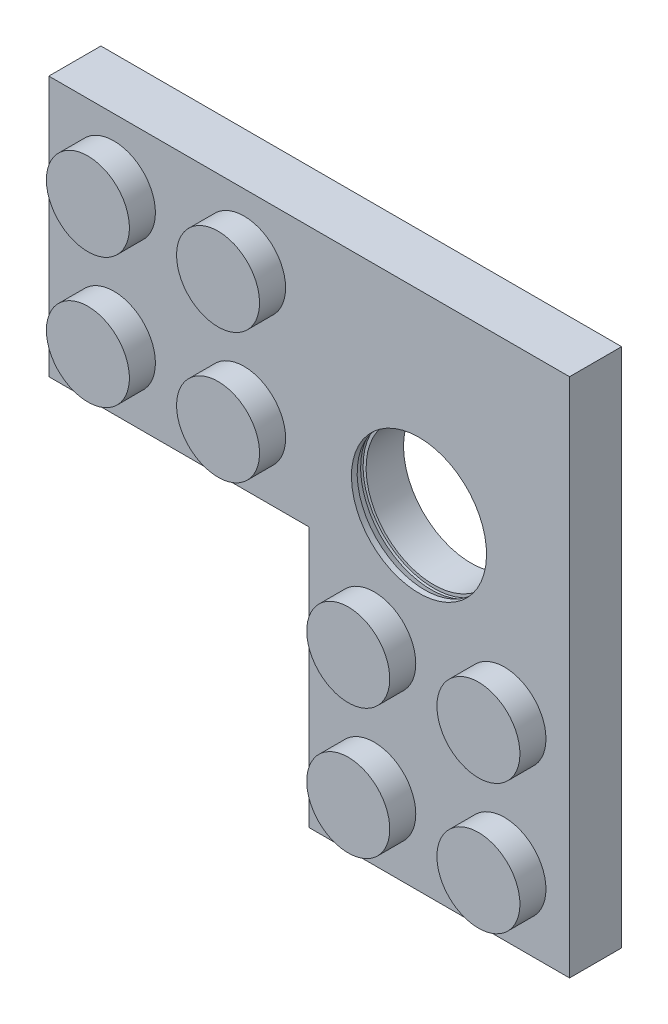
ISO-10303-21;
HEADER;
FILE_DESCRIPTION(('STEP AP214'),'2;1');
FILE_NAME('part.step','',(''),(''),'','','');
FILE_SCHEMA(('AUTOMOTIVE_DESIGN { 1 0 10303 214 1 1 1 1 }'));
ENDSEC;
DATA;
#1=APPLICATION_CONTEXT('core data for automotive mechanical design processes');
#2=APPLICATION_PROTOCOL_DEFINITION('international standard','automotive_design',2000,#1);
#3=PRODUCT_CONTEXT('',#1,'mechanical');
#4=PRODUCT('Part','Part','',(#3));
#5=PRODUCT_RELATED_PRODUCT_CATEGORY('part','',(#4));
#6=PRODUCT_DEFINITION_FORMATION('','',#4);
#7=PRODUCT_DEFINITION_CONTEXT('part definition',#1,'design');
#8=PRODUCT_DEFINITION('design','',#6,#7);
#9=PRODUCT_DEFINITION_SHAPE('','',#8);
#10=(LENGTH_UNIT() NAMED_UNIT(*) SI_UNIT(.MILLI.,.METRE.));
#11=(NAMED_UNIT(*) PLANE_ANGLE_UNIT() SI_UNIT($,.RADIAN.));
#12=(NAMED_UNIT(*) SI_UNIT($,.STERADIAN.) SOLID_ANGLE_UNIT());
#13=UNCERTAINTY_MEASURE_WITH_UNIT(LENGTH_MEASURE(1.E-05),#10,'distance_accuracy_value','');
#14=(GEOMETRIC_REPRESENTATION_CONTEXT(3) GLOBAL_UNCERTAINTY_ASSIGNED_CONTEXT((#13)) GLOBAL_UNIT_ASSIGNED_CONTEXT((#10,
#11,#12)) REPRESENTATION_CONTEXT('',''));
#15=CARTESIAN_POINT('',(0.,0.,0.));
#16=DIRECTION('',(0.,0.,1.));
#17=DIRECTION('',(1.,0.,0.));
#18=AXIS2_PLACEMENT_3D('',#15,#16,#17);
#19=CARTESIAN_POINT('',(4.24621662060961,-52.5000000000012,-20.6000041160965));
#20=DIRECTION('',(0.,0.,1.));
#21=DIRECTION('',(0.,-1.,0.));
#22=AXIS2_PLACEMENT_3D('',#19,#20,#21);
#23=CYLINDRICAL_SURFACE('',#22,4.15);
#24=CARTESIAN_POINT('',(4.24621662060961,-52.5000000000012,-18.3000041160965));
#25=DIRECTION('',(0.,0.,-1.));
#26=DIRECTION('',(0.,1.,0.));
#27=AXIS2_PLACEMENT_3D('',#24,#25,#26);
#28=CIRCLE('',#27,4.15);
#29=CARTESIAN_POINT('',(4.24621662060961,-48.3500000000012,-18.3000041160965));
#30=VERTEX_POINT('',#29);
#31=EDGE_CURVE('E68',#30,#30,#28,.T.);
#32=ORIENTED_EDGE('',*,*,#31,.F.);
#33=EDGE_LOOP('',(#32));
#34=FACE_BOUND('',#33,.T.);
#35=CARTESIAN_POINT('',(4.24621662060961,-52.5000000000012,-20.6000041160965));
#36=DIRECTION('',(0.,0.,-1.));
#37=DIRECTION('',(0.,1.,0.));
#38=AXIS2_PLACEMENT_3D('',#35,#36,#37);
#39=CIRCLE('',#38,4.15);
#40=CARTESIAN_POINT('',(4.24621662060961,-48.3500000000012,-20.6000041160965));
#41=VERTEX_POINT('',#40);
#42=EDGE_CURVE('E159',#41,#41,#39,.T.);
#43=ORIENTED_EDGE('',*,*,#42,.T.);
#44=EDGE_LOOP('',(#43));
#45=FACE_BOUND('',#44,.T.);
#46=ADVANCED_FACE('F64',(#34,#45),#23,.F.);
#47=CARTESIAN_POINT('',(0.,0.,-20.6000041160965));
#48=DIRECTION('',(0.,0.,1.));
#49=DIRECTION('',(1.,0.,0.));
#50=AXIS2_PLACEMENT_3D('',#47,#48,#49);
#51=PLANE('',#50);
#52=CARTESIAN_POINT('',(-6.5011668143576,-44.5,-20.6000041160965));
#53=DIRECTION('',(0.,0.,1.));
#54=DIRECTION('',(1.,0.,0.));
#55=AXIS2_PLACEMENT_3D('',#52,#53,#54);
#56=CIRCLE('',#55,2.55);
#57=CARTESIAN_POINT('',(-3.9511668143576,-44.5,-20.6000041160965));
#58=VERTEX_POINT('',#57);
#59=EDGE_CURVE('E254',#58,#58,#56,.T.);
#60=ORIENTED_EDGE('',*,*,#59,.T.);
#61=EDGE_LOOP('',(#60));
#62=FACE_BOUND('',#61,.T.);
#63=CARTESIAN_POINT('',(-14.5011668143576,-44.5,-20.6000041160965));
#64=DIRECTION('',(0.,0.,1.));
#65=DIRECTION('',(1.,0.,0.));
#66=AXIS2_PLACEMENT_3D('',#63,#64,#65);
#67=CIRCLE('',#66,2.54999999999999);
#68=CARTESIAN_POINT('',(-11.9511668143576,-44.5,-20.6000041160965));
#69=VERTEX_POINT('',#68);
#70=EDGE_CURVE('E261',#69,#69,#67,.T.);
#71=ORIENTED_EDGE('',*,*,#70,.T.);
#72=EDGE_LOOP('',(#71));
#73=FACE_BOUND('',#72,.T.);
#74=CARTESIAN_POINT('',(-14.5011668143576,-52.5,-20.6000041160965));
#75=DIRECTION('',(0.,0.,1.));
#76=DIRECTION('',(1.,0.,0.));
#77=AXIS2_PLACEMENT_3D('',#74,#75,#76);
#78=CIRCLE('',#77,2.55);
#79=CARTESIAN_POINT('',(-11.9511668143576,-52.5,-20.6000041160965));
#80=VERTEX_POINT('',#79);
#81=EDGE_CURVE('E267',#80,#80,#78,.T.);
#82=ORIENTED_EDGE('',*,*,#81,.T.);
#83=EDGE_LOOP('',(#82));
#84=FACE_BOUND('',#83,.T.);
#85=CARTESIAN_POINT('',(9.4988331856424,-60.5,-20.6000041160965));
#86=DIRECTION('',(0.,0.,1.));
#87=DIRECTION('',(1.,0.,0.));
#88=AXIS2_PLACEMENT_3D('',#85,#86,#87);
#89=CIRCLE('',#88,2.55);
#90=CARTESIAN_POINT('',(12.0488331856424,-60.5,-20.6000041160965));
#91=VERTEX_POINT('',#90);
#92=EDGE_CURVE('E273',#91,#91,#89,.T.);
#93=ORIENTED_EDGE('',*,*,#92,.T.);
#94=EDGE_LOOP('',(#93));
#95=FACE_BOUND('',#94,.T.);
#96=CARTESIAN_POINT('',(1.4988331856424,-60.5,-20.6000041160965));
#97=DIRECTION('',(0.,0.,1.));
#98=DIRECTION('',(1.,0.,0.));
#99=AXIS2_PLACEMENT_3D('',#96,#97,#98);
#100=CIRCLE('',#99,2.55);
#101=CARTESIAN_POINT('',(4.0488331856424,-60.5,-20.6000041160965));
#102=VERTEX_POINT('',#101);
#103=EDGE_CURVE('E236',#102,#102,#100,.T.);
#104=ORIENTED_EDGE('',*,*,#103,.T.);
#105=EDGE_LOOP('',(#104));
#106=FACE_BOUND('',#105,.T.);
#107=CARTESIAN_POINT('',(1.4988331856424,-68.5,-20.6000041160965));
#108=DIRECTION('',(0.,0.,1.));
#109=DIRECTION('',(1.,0.,0.));
#110=AXIS2_PLACEMENT_3D('',#107,#108,#109);
#111=CIRCLE('',#110,2.55);
#112=CARTESIAN_POINT('',(4.0488331856424,-68.5,-20.6000041160965));
#113=VERTEX_POINT('',#112);
#114=EDGE_CURVE('E243',#113,#113,#111,.T.);
#115=ORIENTED_EDGE('',*,*,#114,.T.);
#116=EDGE_LOOP('',(#115));
#117=FACE_BOUND('',#116,.T.);
#118=CARTESIAN_POINT('',(9.4988331856424,-68.5,-20.6000041160965));
#119=DIRECTION('',(0.,0.,1.));
#120=DIRECTION('',(1.,0.,0.));
#121=AXIS2_PLACEMENT_3D('',#118,#119,#120);
#122=CIRCLE('',#121,2.55);
#123=CARTESIAN_POINT('',(12.0488331856424,-68.5,-20.6000041160965));
#124=VERTEX_POINT('',#123);
#125=EDGE_CURVE('E249',#124,#124,#122,.T.);
#126=ORIENTED_EDGE('',*,*,#125,.T.);
#127=EDGE_LOOP('',(#126));
#128=FACE_BOUND('',#127,.T.);
#129=CARTESIAN_POINT('',(-6.5011668143576,-52.5,-20.6000041160965));
#130=DIRECTION('',(0.,0.,1.));
#131=DIRECTION('',(1.,0.,0.));
#132=AXIS2_PLACEMENT_3D('',#129,#130,#131);
#133=CIRCLE('',#132,2.55);
#134=CARTESIAN_POINT('',(-3.9511668143576,-52.5,-20.6000041160965));
#135=VERTEX_POINT('',#134);
#136=EDGE_CURVE('E257',#135,#135,#133,.T.);
#137=ORIENTED_EDGE('',*,*,#136,.T.);
#138=EDGE_LOOP('',(#137));
#139=FACE_BOUND('',#138,.T.);
#140=DIRECTION('',(0.,-1.,0.));
#141=VECTOR('',#140,1.);
#142=CARTESIAN_POINT('',(-2.5011668143576,-56.5,-20.6000041160965));
#143=LINE('',#142,#141);
#144=CARTESIAN_POINT('',(-2.5011668143576,-56.5,-20.6000041160965));
#145=VERTEX_POINT('',#144);
#146=CARTESIAN_POINT('',(-2.5011668143576,-72.5,-20.6000041160965));
#147=VERTEX_POINT('',#146);
#148=EDGE_CURVE('E171',#145,#147,#143,.T.);
#149=ORIENTED_EDGE('',*,*,#148,.F.);
#150=DIRECTION('',(1.,0.,0.));
#151=VECTOR('',#150,1.);
#152=CARTESIAN_POINT('',(-18.5011668143576,-56.5,-20.6000041160965));
#153=LINE('',#152,#151);
#154=CARTESIAN_POINT('',(-18.5011668143576,-56.5,-20.6000041160965));
#155=VERTEX_POINT('',#154);
#156=EDGE_CURVE('E145',#155,#145,#153,.T.);
#157=ORIENTED_EDGE('',*,*,#156,.F.);
#158=DIRECTION('',(0.,-1.,0.));
#159=VECTOR('',#158,1.);
#160=CARTESIAN_POINT('',(-18.5011668143576,-40.5,-20.6000041160965));
#161=LINE('',#160,#159);
#162=CARTESIAN_POINT('',(-18.5011668143576,-40.5,-20.6000041160965));
#163=VERTEX_POINT('',#162);
#164=EDGE_CURVE('E129',#163,#155,#161,.T.);
#165=ORIENTED_EDGE('',*,*,#164,.F.);
#166=DIRECTION('',(-1.,0.,0.));
#167=VECTOR('',#166,1.);
#168=CARTESIAN_POINT('',(13.4988331856424,-40.5,-20.6000041160965));
#169=LINE('',#168,#167);
#170=CARTESIAN_POINT('',(13.4988331856424,-40.5,-20.6000041160965));
#171=VERTEX_POINT('',#170);
#172=EDGE_CURVE('E143',#171,#163,#169,.T.);
#173=ORIENTED_EDGE('',*,*,#172,.F.);
#174=DIRECTION('',(0.,1.,0.));
#175=VECTOR('',#174,1.);
#176=CARTESIAN_POINT('',(13.4988331856424,-72.5,-20.6000041160965));
#177=LINE('',#176,#175);
#178=CARTESIAN_POINT('',(13.4988331856424,-72.5,-20.6000041160965));
#179=VERTEX_POINT('',#178);
#180=EDGE_CURVE('E148',#179,#171,#177,.T.);
#181=ORIENTED_EDGE('',*,*,#180,.F.);
#182=DIRECTION('',(1.,0.,0.));
#183=VECTOR('',#182,1.);
#184=CARTESIAN_POINT('',(-2.5011668143576,-72.5,-20.6000041160965));
#185=LINE('',#184,#183);
#186=EDGE_CURVE('E150',#147,#179,#185,.T.);
#187=ORIENTED_EDGE('',*,*,#186,.F.);
#188=EDGE_LOOP('',(#149,#157,#165,#173,#181,#187));
#189=FACE_BOUND('',#188,.T.);
#190=ORIENTED_EDGE('',*,*,#42,.F.);
#191=EDGE_LOOP('',(#190));
#192=FACE_BOUND('',#191,.T.);
#193=ADVANCED_FACE('F140',(#62,#73,#84,#95,#106,#117,#128,#139,#189,#192),#51,.F.);
#194=CARTESIAN_POINT('',(0.,0.,-17.4000041160965));
#195=DIRECTION('',(0.,0.,1.));
#196=DIRECTION('',(1.,0.,0.));
#197=AXIS2_PLACEMENT_3D('',#194,#195,#196);
#198=PLANE('',#197);
#199=CARTESIAN_POINT('',(-14.5011668143576,-44.5,-17.4000041160965));
#200=DIRECTION('',(0.,0.,1.));
#201=DIRECTION('',(1.,0.,0.));
#202=AXIS2_PLACEMENT_3D('',#199,#200,#201);
#203=CIRCLE('',#202,2.54999999999999);
#204=CARTESIAN_POINT('',(-11.9511668143576,-44.5,-17.4000041160965));
#205=VERTEX_POINT('',#204);
#206=EDGE_CURVE('E12',#205,#205,#203,.T.);
#207=ORIENTED_EDGE('',*,*,#206,.F.);
#208=EDGE_LOOP('',(#207));
#209=FACE_BOUND('',#208,.T.);
#210=CARTESIAN_POINT('',(-14.5011668143576,-52.5,-17.4000041160965));
#211=DIRECTION('',(0.,0.,1.));
#212=DIRECTION('',(1.,0.,0.));
#213=AXIS2_PLACEMENT_3D('',#210,#211,#212);
#214=CIRCLE('',#213,2.55);
#215=CARTESIAN_POINT('',(-11.9511668143576,-52.5,-17.4000041160965));
#216=VERTEX_POINT('',#215);
#217=EDGE_CURVE('E74',#216,#216,#214,.T.);
#218=ORIENTED_EDGE('',*,*,#217,.F.);
#219=EDGE_LOOP('',(#218));
#220=FACE_BOUND('',#219,.T.);
#221=CARTESIAN_POINT('',(-6.5011668143576,-52.5,-17.4000041160965));
#222=DIRECTION('',(0.,0.,1.));
#223=DIRECTION('',(1.,0.,0.));
#224=AXIS2_PLACEMENT_3D('',#221,#222,#223);
#225=CIRCLE('',#224,2.55);
#226=CARTESIAN_POINT('',(-3.9511668143576,-52.5,-17.4000041160965));
#227=VERTEX_POINT('',#226);
#228=EDGE_CURVE('E193',#227,#227,#225,.T.);
#229=ORIENTED_EDGE('',*,*,#228,.F.);
#230=EDGE_LOOP('',(#229));
#231=FACE_BOUND('',#230,.T.);
#232=CARTESIAN_POINT('',(1.4988331856424,-60.5,-17.4000041160965));
#233=DIRECTION('',(0.,0.,1.));
#234=DIRECTION('',(1.,0.,0.));
#235=AXIS2_PLACEMENT_3D('',#232,#233,#234);
#236=CIRCLE('',#235,2.55);
#237=CARTESIAN_POINT('',(4.0488331856424,-60.5,-17.4000041160965));
#238=VERTEX_POINT('',#237);
#239=EDGE_CURVE('E190',#238,#238,#236,.T.);
#240=ORIENTED_EDGE('',*,*,#239,.F.);
#241=EDGE_LOOP('',(#240));
#242=FACE_BOUND('',#241,.T.);
#243=CARTESIAN_POINT('',(9.4988331856424,-68.5,-17.4000041160965));
#244=DIRECTION('',(0.,0.,1.));
#245=DIRECTION('',(1.,0.,0.));
#246=AXIS2_PLACEMENT_3D('',#243,#244,#245);
#247=CIRCLE('',#246,2.55);
#248=CARTESIAN_POINT('',(12.0488331856424,-68.5,-17.4000041160965));
#249=VERTEX_POINT('',#248);
#250=EDGE_CURVE('E187',#249,#249,#247,.T.);
#251=ORIENTED_EDGE('',*,*,#250,.F.);
#252=EDGE_LOOP('',(#251));
#253=FACE_BOUND('',#252,.T.);
#254=CARTESIAN_POINT('',(9.4988331856424,-60.5,-17.4000041160965));
#255=DIRECTION('',(0.,0.,1.));
#256=DIRECTION('',(1.,0.,0.));
#257=AXIS2_PLACEMENT_3D('',#254,#255,#256);
#258=CIRCLE('',#257,2.55);
#259=CARTESIAN_POINT('',(12.0488331856424,-60.5,-17.4000041160965));
#260=VERTEX_POINT('',#259);
#261=EDGE_CURVE('E184',#260,#260,#258,.T.);
#262=ORIENTED_EDGE('',*,*,#261,.F.);
#263=EDGE_LOOP('',(#262));
#264=FACE_BOUND('',#263,.T.);
#265=CARTESIAN_POINT('',(1.4988331856424,-68.5,-17.4000041160965));
#266=DIRECTION('',(0.,0.,1.));
#267=DIRECTION('',(1.,0.,0.));
#268=AXIS2_PLACEMENT_3D('',#265,#266,#267);
#269=CIRCLE('',#268,2.55);
#270=CARTESIAN_POINT('',(4.0488331856424,-68.5,-17.4000041160965));
#271=VERTEX_POINT('',#270);
#272=EDGE_CURVE('E181',#271,#271,#269,.T.);
#273=ORIENTED_EDGE('',*,*,#272,.F.);
#274=EDGE_LOOP('',(#273));
#275=FACE_BOUND('',#274,.T.);
#276=CARTESIAN_POINT('',(-6.5011668143576,-44.5,-17.4000041160965));
#277=DIRECTION('',(0.,0.,1.));
#278=DIRECTION('',(1.,0.,0.));
#279=AXIS2_PLACEMENT_3D('',#276,#277,#278);
#280=CIRCLE('',#279,2.55);
#281=CARTESIAN_POINT('',(-3.9511668143576,-44.5,-17.4000041160965));
#282=VERTEX_POINT('',#281);
#283=EDGE_CURVE('E173',#282,#282,#280,.T.);
#284=ORIENTED_EDGE('',*,*,#283,.F.);
#285=EDGE_LOOP('',(#284));
#286=FACE_BOUND('',#285,.T.);
#287=DIRECTION('',(0.,-1.,0.));
#288=VECTOR('',#287,1.);
#289=CARTESIAN_POINT('',(-2.5011668143576,-56.5,-17.4000041160965));
#290=LINE('',#289,#288);
#291=CARTESIAN_POINT('',(-2.5011668143576,-56.5,-17.4000041160965));
#292=VERTEX_POINT('',#291);
#293=CARTESIAN_POINT('',(-2.5011668143576,-72.5,-17.4000041160965));
#294=VERTEX_POINT('',#293);
#295=EDGE_CURVE('E155',#292,#294,#290,.T.);
#296=ORIENTED_EDGE('',*,*,#295,.T.);
#297=DIRECTION('',(1.,0.,0.));
#298=VECTOR('',#297,1.);
#299=CARTESIAN_POINT('',(-2.5011668143576,-72.5,-17.4000041160965));
#300=LINE('',#299,#298);
#301=CARTESIAN_POINT('',(13.4988331856424,-72.5,-17.4000041160965));
#302=VERTEX_POINT('',#301);
#303=EDGE_CURVE('E158',#294,#302,#300,.T.);
#304=ORIENTED_EDGE('',*,*,#303,.T.);
#305=DIRECTION('',(0.,1.,0.));
#306=VECTOR('',#305,1.);
#307=CARTESIAN_POINT('',(13.4988331856424,-72.5,-17.4000041160965));
#308=LINE('',#307,#306);
#309=CARTESIAN_POINT('',(13.4988331856424,-40.5,-17.4000041160965));
#310=VERTEX_POINT('',#309);
#311=EDGE_CURVE('E162',#302,#310,#308,.T.);
#312=ORIENTED_EDGE('',*,*,#311,.T.);
#313=DIRECTION('',(-1.,0.,0.));
#314=VECTOR('',#313,1.);
#315=CARTESIAN_POINT('',(13.4988331856424,-40.5,-17.4000041160965));
#316=LINE('',#315,#314);
#317=CARTESIAN_POINT('',(-18.5011668143576,-40.5,-17.4000041160965));
#318=VERTEX_POINT('',#317);
#319=EDGE_CURVE('E165',#310,#318,#316,.T.);
#320=ORIENTED_EDGE('',*,*,#319,.T.);
#321=DIRECTION('',(0.,-1.,0.));
#322=VECTOR('',#321,1.);
#323=CARTESIAN_POINT('',(-18.5011668143576,-40.5,-17.4000041160965));
#324=LINE('',#323,#322);
#325=CARTESIAN_POINT('',(-18.5011668143576,-56.5,-17.4000041160965));
#326=VERTEX_POINT('',#325);
#327=EDGE_CURVE('E131',#318,#326,#324,.T.);
#328=ORIENTED_EDGE('',*,*,#327,.T.);
#329=DIRECTION('',(1.,0.,0.));
#330=VECTOR('',#329,1.);
#331=CARTESIAN_POINT('',(-18.5011668143576,-56.5,-17.4000041160965));
#332=LINE('',#331,#330);
#333=EDGE_CURVE('E168',#326,#292,#332,.T.);
#334=ORIENTED_EDGE('',*,*,#333,.T.);
#335=EDGE_LOOP('',(#296,#304,#312,#320,#328,#334));
#336=FACE_BOUND('',#335,.T.);
#337=CARTESIAN_POINT('',(4.24621662060961,-52.5000000000012,-17.4000041160965));
#338=DIRECTION('',(0.,0.,-1.));
#339=DIRECTION('',(0.,1.,0.));
#340=AXIS2_PLACEMENT_3D('',#337,#338,#339);
#341=CIRCLE('',#340,4.15);
#342=CARTESIAN_POINT('',(4.24621662060961,-48.3500000000012,-17.4000041160965));
#343=VERTEX_POINT('',#342);
#344=EDGE_CURVE('E281',#343,#343,#341,.T.);
#345=ORIENTED_EDGE('',*,*,#344,.T.);
#346=EDGE_LOOP('',(#345));
#347=FACE_BOUND('',#346,.T.);
#348=ADVANCED_FACE('F291',(#209,#220,#231,#242,#253,#264,#275,#286,#336,#347),#198,.T.);
#349=CARTESIAN_POINT('',(-2.5011668143576,-56.5,-20.6000041160965));
#350=DIRECTION('',(-1.,0.,0.));
#351=DIRECTION('',(0.,-1.,0.));
#352=AXIS2_PLACEMENT_3D('',#349,#350,#351);
#353=PLANE('',#352);
#354=ORIENTED_EDGE('',*,*,#295,.F.);
#355=DIRECTION('',(0.,0.,1.));
#356=VECTOR('',#355,1.);
#357=CARTESIAN_POINT('',(-2.5011668143576,-56.5,-20.6000041160965));
#358=LINE('',#357,#356);
#359=EDGE_CURVE('E83',#145,#292,#358,.T.);
#360=ORIENTED_EDGE('',*,*,#359,.F.);
#361=ORIENTED_EDGE('',*,*,#148,.T.);
#362=DIRECTION('',(0.,0.,1.));
#363=VECTOR('',#362,1.);
#364=CARTESIAN_POINT('',(-2.5011668143576,-72.5,-20.6000041160965));
#365=LINE('',#364,#363);
#366=EDGE_CURVE('E118',#147,#294,#365,.T.);
#367=ORIENTED_EDGE('',*,*,#366,.T.);
#368=EDGE_LOOP('',(#354,#360,#361,#367));
#369=FACE_BOUND('',#368,.T.);
#370=ADVANCED_FACE('F66',(#369),#353,.T.);
#371=CARTESIAN_POINT('',(-18.5011668143576,-56.5,-20.6000041160965));
#372=DIRECTION('',(0.,-1.,0.));
#373=DIRECTION('',(1.,0.,0.));
#374=AXIS2_PLACEMENT_3D('',#371,#372,#373);
#375=PLANE('',#374);
#376=ORIENTED_EDGE('',*,*,#333,.F.);
#377=DIRECTION('',(0.,0.,1.));
#378=VECTOR('',#377,1.);
#379=CARTESIAN_POINT('',(-18.5011668143576,-56.5,-20.6000041160965));
#380=LINE('',#379,#378);
#381=EDGE_CURVE('E106',#155,#326,#380,.T.);
#382=ORIENTED_EDGE('',*,*,#381,.F.);
#383=ORIENTED_EDGE('',*,*,#156,.T.);
#384=ORIENTED_EDGE('',*,*,#359,.T.);
#385=EDGE_LOOP('',(#376,#382,#383,#384));
#386=FACE_BOUND('',#385,.T.);
#387=ADVANCED_FACE('F293',(#386),#375,.T.);
#388=CARTESIAN_POINT('',(-18.5011668143576,-40.5,-20.6000041160965));
#389=DIRECTION('',(-1.,0.,0.));
#390=DIRECTION('',(0.,-1.,0.));
#391=AXIS2_PLACEMENT_3D('',#388,#389,#390);
#392=PLANE('',#391);
#393=ORIENTED_EDGE('',*,*,#327,.F.);
#394=DIRECTION('',(0.,0.,1.));
#395=VECTOR('',#394,1.);
#396=CARTESIAN_POINT('',(-18.5011668143576,-40.5,-20.6000041160965));
#397=LINE('',#396,#395);
#398=EDGE_CURVE('E126',#163,#318,#397,.T.);
#399=ORIENTED_EDGE('',*,*,#398,.F.);
#400=ORIENTED_EDGE('',*,*,#164,.T.);
#401=ORIENTED_EDGE('',*,*,#381,.T.);
#402=EDGE_LOOP('',(#393,#399,#400,#401));
#403=FACE_BOUND('',#402,.T.);
#404=ADVANCED_FACE('F128',(#403),#392,.T.);
#405=CARTESIAN_POINT('',(13.4988331856424,-40.5,-20.6000041160965));
#406=DIRECTION('',(0.,1.,0.));
#407=DIRECTION('',(-1.,0.,0.));
#408=AXIS2_PLACEMENT_3D('',#405,#406,#407);
#409=PLANE('',#408);
#410=ORIENTED_EDGE('',*,*,#319,.F.);
#411=DIRECTION('',(0.,0.,1.));
#412=VECTOR('',#411,1.);
#413=CARTESIAN_POINT('',(13.4988331856424,-40.5,-20.6000041160965));
#414=LINE('',#413,#412);
#415=EDGE_CURVE('E136',#171,#310,#414,.T.);
#416=ORIENTED_EDGE('',*,*,#415,.F.);
#417=ORIENTED_EDGE('',*,*,#172,.T.);
#418=ORIENTED_EDGE('',*,*,#398,.T.);
#419=EDGE_LOOP('',(#410,#416,#417,#418));
#420=FACE_BOUND('',#419,.T.);
#421=ADVANCED_FACE('F147',(#420),#409,.T.);
#422=CARTESIAN_POINT('',(13.4988331856424,-72.5,-20.6000041160965));
#423=DIRECTION('',(1.,0.,0.));
#424=DIRECTION('',(0.,0.,-1.));
#425=AXIS2_PLACEMENT_3D('',#422,#423,#424);
#426=PLANE('',#425);
#427=ORIENTED_EDGE('',*,*,#311,.F.);
#428=DIRECTION('',(0.,0.,1.));
#429=VECTOR('',#428,1.);
#430=CARTESIAN_POINT('',(13.4988331856424,-72.5,-20.6000041160965));
#431=LINE('',#430,#429);
#432=EDGE_CURVE('E176',#179,#302,#431,.T.);
#433=ORIENTED_EDGE('',*,*,#432,.F.);
#434=ORIENTED_EDGE('',*,*,#180,.T.);
#435=ORIENTED_EDGE('',*,*,#415,.T.);
#436=EDGE_LOOP('',(#427,#433,#434,#435));
#437=FACE_BOUND('',#436,.T.);
#438=ADVANCED_FACE('F325',(#437),#426,.T.);
#439=CARTESIAN_POINT('',(-2.5011668143576,-72.5,-20.6000041160965));
#440=DIRECTION('',(0.,-1.,0.));
#441=DIRECTION('',(0.,0.,-1.));
#442=AXIS2_PLACEMENT_3D('',#439,#440,#441);
#443=PLANE('',#442);
#444=ORIENTED_EDGE('',*,*,#303,.F.);
#445=ORIENTED_EDGE('',*,*,#366,.F.);
#446=ORIENTED_EDGE('',*,*,#186,.T.);
#447=ORIENTED_EDGE('',*,*,#432,.T.);
#448=EDGE_LOOP('',(#444,#445,#446,#447));
#449=FACE_BOUND('',#448,.T.);
#450=ADVANCED_FACE('F288',(#449),#443,.T.);
#451=CARTESIAN_POINT('',(4.24621662061194,-52.4999999999999,-17.7500601076954));
#452=DIRECTION('',(0.,0.,-1.));
#453=DIRECTION('',(0.,1.,0.));
#454=AXIS2_PLACEMENT_3D('',#451,#452,#453);
#455=CIRCLE('',#454,4.15);
#456=CARTESIAN_POINT('',(4.24621662061194,-48.3499999999999,-17.7500601076954));
#457=VERTEX_POINT('',#456);
#458=EDGE_CURVE('E197',#457,#457,#455,.F.);
#459=ORIENTED_EDGE('',*,*,#458,.F.);
#460=EDGE_LOOP('',(#459));
#461=FACE_BOUND('',#460,.T.);
#462=ORIENTED_EDGE('',*,*,#344,.F.);
#463=EDGE_LOOP('',(#462));
#464=FACE_BOUND('',#463,.T.);
#465=ADVANCED_FACE('F305',(#461,#464),#23,.F.);
#466=CARTESIAN_POINT('',(-6.5011668143576,-52.5,-18.8000041160965));
#467=DIRECTION('',(0.,0.,-1.));
#468=DIRECTION('',(0.,1.,0.));
#469=AXIS2_PLACEMENT_3D('',#466,#467,#468);
#470=CYLINDRICAL_SURFACE('',#469,2.55);
#471=CARTESIAN_POINT('',(-6.5011668143576,-52.5,-18.8000041160965));
#472=DIRECTION('',(0.,0.,1.));
#473=DIRECTION('',(1.,0.,0.));
#474=AXIS2_PLACEMENT_3D('',#471,#472,#473);
#475=CIRCLE('',#474,2.55);
#476=CARTESIAN_POINT('',(-3.9511668143576,-52.5,-18.8000041160965));
#477=VERTEX_POINT('',#476);
#478=EDGE_CURVE('E278',#477,#477,#475,.T.);
#479=ORIENTED_EDGE('',*,*,#478,.T.);
#480=EDGE_LOOP('',(#479));
#481=FACE_BOUND('',#480,.T.);
#482=ORIENTED_EDGE('',*,*,#136,.F.);
#483=EDGE_LOOP('',(#482));
#484=FACE_BOUND('',#483,.T.);
#485=ADVANCED_FACE('F316',(#481,#484),#470,.F.);
#486=CARTESIAN_POINT('',(-6.5011668143576,-52.5,-18.8000041160965));
#487=DIRECTION('',(0.,0.,1.));
#488=DIRECTION('',(1.,0.,0.));
#489=AXIS2_PLACEMENT_3D('',#486,#487,#488);
#490=PLANE('',#489);
#491=ORIENTED_EDGE('',*,*,#478,.F.);
#492=EDGE_LOOP('',(#491));
#493=FACE_BOUND('',#492,.T.);
#494=ADVANCED_FACE('F322',(#493),#490,.F.);
#495=CARTESIAN_POINT('',(9.4988331856424,-68.5,-18.8000041160965));
#496=DIRECTION('',(0.,0.,-1.));
#497=DIRECTION('',(0.,1.,0.));
#498=AXIS2_PLACEMENT_3D('',#495,#496,#497);
#499=CYLINDRICAL_SURFACE('',#498,2.55);
#500=CARTESIAN_POINT('',(9.4988331856424,-68.5,-18.8000041160965));
#501=DIRECTION('',(0.,0.,1.));
#502=DIRECTION('',(1.,0.,0.));
#503=AXIS2_PLACEMENT_3D('',#500,#501,#502);
#504=CIRCLE('',#503,2.55);
#505=CARTESIAN_POINT('',(12.0488331856424,-68.5,-18.8000041160965));
#506=VERTEX_POINT('',#505);
#507=EDGE_CURVE('E235',#506,#506,#504,.T.);
#508=ORIENTED_EDGE('',*,*,#507,.T.);
#509=EDGE_LOOP('',(#508));
#510=FACE_BOUND('',#509,.T.);
#511=ORIENTED_EDGE('',*,*,#125,.F.);
#512=EDGE_LOOP('',(#511));
#513=FACE_BOUND('',#512,.T.);
#514=ADVANCED_FACE('F384',(#510,#513),#499,.F.);
#515=CARTESIAN_POINT('',(9.4988331856424,-68.5,-18.8000041160965));
#516=DIRECTION('',(0.,0.,1.));
#517=DIRECTION('',(1.,0.,0.));
#518=AXIS2_PLACEMENT_3D('',#515,#516,#517);
#519=PLANE('',#518);
#520=ORIENTED_EDGE('',*,*,#507,.F.);
#521=EDGE_LOOP('',(#520));
#522=FACE_BOUND('',#521,.T.);
#523=ADVANCED_FACE('F379',(#522),#519,.F.);
#524=CARTESIAN_POINT('',(1.4988331856424,-68.5,-18.8000041160965));
#525=DIRECTION('',(0.,0.,-1.));
#526=DIRECTION('',(0.,1.,0.));
#527=AXIS2_PLACEMENT_3D('',#524,#525,#526);
#528=CYLINDRICAL_SURFACE('',#527,2.55);
#529=CARTESIAN_POINT('',(1.4988331856424,-68.5,-18.8000041160965));
#530=DIRECTION('',(0.,0.,1.));
#531=DIRECTION('',(1.,0.,0.));
#532=AXIS2_PLACEMENT_3D('',#529,#530,#531);
#533=CIRCLE('',#532,2.55);
#534=CARTESIAN_POINT('',(4.0488331856424,-68.5,-18.8000041160965));
#535=VERTEX_POINT('',#534);
#536=EDGE_CURVE('E246',#535,#535,#533,.T.);
#537=ORIENTED_EDGE('',*,*,#536,.T.);
#538=EDGE_LOOP('',(#537));
#539=FACE_BOUND('',#538,.T.);
#540=ORIENTED_EDGE('',*,*,#114,.F.);
#541=EDGE_LOOP('',(#540));
#542=FACE_BOUND('',#541,.T.);
#543=ADVANCED_FACE('F376',(#539,#542),#528,.F.);
#544=CARTESIAN_POINT('',(1.4988331856424,-68.5,-18.8000041160965));
#545=DIRECTION('',(0.,0.,1.));
#546=DIRECTION('',(1.,0.,0.));
#547=AXIS2_PLACEMENT_3D('',#544,#545,#546);
#548=PLANE('',#547);
#549=ORIENTED_EDGE('',*,*,#536,.F.);
#550=EDGE_LOOP('',(#549));
#551=FACE_BOUND('',#550,.T.);
#552=ADVANCED_FACE('F370',(#551),#548,.F.);
#553=CARTESIAN_POINT('',(1.4988331856424,-60.5,-18.8000041160965));
#554=DIRECTION('',(0.,0.,-1.));
#555=DIRECTION('',(0.,1.,0.));
#556=AXIS2_PLACEMENT_3D('',#553,#554,#555);
#557=CYLINDRICAL_SURFACE('',#556,2.55);
#558=CARTESIAN_POINT('',(1.4988331856424,-60.5,-18.8000041160965));
#559=DIRECTION('',(0.,0.,1.));
#560=DIRECTION('',(1.,0.,0.));
#561=AXIS2_PLACEMENT_3D('',#558,#559,#560);
#562=CIRCLE('',#561,2.55);
#563=CARTESIAN_POINT('',(4.0488331856424,-60.5,-18.8000041160965));
#564=VERTEX_POINT('',#563);
#565=EDGE_CURVE('E240',#564,#564,#562,.T.);
#566=ORIENTED_EDGE('',*,*,#565,.T.);
#567=EDGE_LOOP('',(#566));
#568=FACE_BOUND('',#567,.T.);
#569=ORIENTED_EDGE('',*,*,#103,.F.);
#570=EDGE_LOOP('',(#569));
#571=FACE_BOUND('',#570,.T.);
#572=ADVANCED_FACE('F366',(#568,#571),#557,.F.);
#573=CARTESIAN_POINT('',(1.4988331856424,-60.5,-18.8000041160965));
#574=DIRECTION('',(0.,0.,1.));
#575=DIRECTION('',(1.,0.,0.));
#576=AXIS2_PLACEMENT_3D('',#573,#574,#575);
#577=PLANE('',#576);
#578=ORIENTED_EDGE('',*,*,#565,.F.);
#579=EDGE_LOOP('',(#578));
#580=FACE_BOUND('',#579,.T.);
#581=ADVANCED_FACE('F369',(#580),#577,.F.);
#582=CARTESIAN_POINT('',(9.4988331856424,-60.5,-18.8000041160965));
#583=DIRECTION('',(0.,0.,-1.));
#584=DIRECTION('',(0.,1.,0.));
#585=AXIS2_PLACEMENT_3D('',#582,#583,#584);
#586=CYLINDRICAL_SURFACE('',#585,2.55);
#587=CARTESIAN_POINT('',(9.4988331856424,-60.5,-18.8000041160965));
#588=DIRECTION('',(0.,0.,1.));
#589=DIRECTION('',(1.,0.,0.));
#590=AXIS2_PLACEMENT_3D('',#587,#588,#589);
#591=CIRCLE('',#590,2.55);
#592=CARTESIAN_POINT('',(12.0488331856424,-60.5,-18.8000041160965));
#593=VERTEX_POINT('',#592);
#594=EDGE_CURVE('E239',#593,#593,#591,.T.);
#595=ORIENTED_EDGE('',*,*,#594,.T.);
#596=EDGE_LOOP('',(#595));
#597=FACE_BOUND('',#596,.T.);
#598=ORIENTED_EDGE('',*,*,#92,.F.);
#599=EDGE_LOOP('',(#598));
#600=FACE_BOUND('',#599,.T.);
#601=ADVANCED_FACE('F374',(#597,#600),#586,.F.);
#602=CARTESIAN_POINT('',(9.4988331856424,-60.5,-18.8000041160965));
#603=DIRECTION('',(0.,0.,1.));
#604=DIRECTION('',(1.,0.,0.));
#605=AXIS2_PLACEMENT_3D('',#602,#603,#604);
#606=PLANE('',#605);
#607=ORIENTED_EDGE('',*,*,#594,.F.);
#608=EDGE_LOOP('',(#607));
#609=FACE_BOUND('',#608,.T.);
#610=ADVANCED_FACE('F406',(#609),#606,.F.);
#611=CARTESIAN_POINT('',(-14.5011668143576,-52.5,-18.8000041160965));
#612=DIRECTION('',(0.,0.,-1.));
#613=DIRECTION('',(0.,1.,0.));
#614=AXIS2_PLACEMENT_3D('',#611,#612,#613);
#615=CYLINDRICAL_SURFACE('',#614,2.55);
#616=CARTESIAN_POINT('',(-14.5011668143576,-52.5,-18.8000041160965));
#617=DIRECTION('',(0.,0.,1.));
#618=DIRECTION('',(1.,0.,0.));
#619=AXIS2_PLACEMENT_3D('',#616,#617,#618);
#620=CIRCLE('',#619,2.55);
#621=CARTESIAN_POINT('',(-11.9511668143576,-52.5,-18.8000041160965));
#622=VERTEX_POINT('',#621);
#623=EDGE_CURVE('E270',#622,#622,#620,.T.);
#624=ORIENTED_EDGE('',*,*,#623,.T.);
#625=EDGE_LOOP('',(#624));
#626=FACE_BOUND('',#625,.T.);
#627=ORIENTED_EDGE('',*,*,#81,.F.);
#628=EDGE_LOOP('',(#627));
#629=FACE_BOUND('',#628,.T.);
#630=ADVANCED_FACE('F403',(#626,#629),#615,.F.);
#631=CARTESIAN_POINT('',(-14.5011668143576,-52.5,-18.8000041160965));
#632=DIRECTION('',(0.,0.,1.));
#633=DIRECTION('',(1.,0.,0.));
#634=AXIS2_PLACEMENT_3D('',#631,#632,#633);
#635=PLANE('',#634);
#636=ORIENTED_EDGE('',*,*,#623,.F.);
#637=EDGE_LOOP('',(#636));
#638=FACE_BOUND('',#637,.T.);
#639=ADVANCED_FACE('F398',(#638),#635,.F.);
#640=CARTESIAN_POINT('',(-14.5011668143576,-44.5,-18.8000041160965));
#641=DIRECTION('',(0.,0.,-1.));
#642=DIRECTION('',(0.,1.,0.));
#643=AXIS2_PLACEMENT_3D('',#640,#641,#642);
#644=CYLINDRICAL_SURFACE('',#643,2.54999999999999);
#645=CARTESIAN_POINT('',(-14.5011668143576,-44.5,-18.8000041160965));
#646=DIRECTION('',(0.,0.,1.));
#647=DIRECTION('',(1.,0.,0.));
#648=AXIS2_PLACEMENT_3D('',#645,#646,#647);
#649=CIRCLE('',#648,2.54999999999999);
#650=CARTESIAN_POINT('',(-11.9511668143576,-44.5,-18.8000041160965));
#651=VERTEX_POINT('',#650);
#652=EDGE_CURVE('E264',#651,#651,#649,.T.);
#653=ORIENTED_EDGE('',*,*,#652,.T.);
#654=EDGE_LOOP('',(#653));
#655=FACE_BOUND('',#654,.T.);
#656=ORIENTED_EDGE('',*,*,#70,.F.);
#657=EDGE_LOOP('',(#656));
#658=FACE_BOUND('',#657,.T.);
#659=ADVANCED_FACE('F395',(#655,#658),#644,.F.);
#660=CARTESIAN_POINT('',(-14.5011668143576,-44.5,-18.8000041160965));
#661=DIRECTION('',(0.,0.,1.));
#662=DIRECTION('',(1.,0.,0.));
#663=AXIS2_PLACEMENT_3D('',#660,#661,#662);
#664=PLANE('',#663);
#665=ORIENTED_EDGE('',*,*,#652,.F.);
#666=EDGE_LOOP('',(#665));
#667=FACE_BOUND('',#666,.T.);
#668=ADVANCED_FACE('F392',(#667),#664,.F.);
#669=CARTESIAN_POINT('',(-6.5011668143576,-44.5,-18.8000041160965));
#670=DIRECTION('',(0.,0.,-1.));
#671=DIRECTION('',(0.,1.,0.));
#672=AXIS2_PLACEMENT_3D('',#669,#670,#671);
#673=CYLINDRICAL_SURFACE('',#672,2.55);
#674=CARTESIAN_POINT('',(-6.5011668143576,-44.5,-18.8000041160965));
#675=DIRECTION('',(0.,0.,1.));
#676=DIRECTION('',(1.,0.,0.));
#677=AXIS2_PLACEMENT_3D('',#674,#675,#676);
#678=CIRCLE('',#677,2.55);
#679=CARTESIAN_POINT('',(-3.9511668143576,-44.5,-18.8000041160965));
#680=VERTEX_POINT('',#679);
#681=EDGE_CURVE('E258',#680,#680,#678,.T.);
#682=ORIENTED_EDGE('',*,*,#681,.T.);
#683=EDGE_LOOP('',(#682));
#684=FACE_BOUND('',#683,.T.);
#685=ORIENTED_EDGE('',*,*,#59,.F.);
#686=EDGE_LOOP('',(#685));
#687=FACE_BOUND('',#686,.T.);
#688=ADVANCED_FACE('F361',(#684,#687),#673,.F.);
#689=CARTESIAN_POINT('',(-6.5011668143576,-44.5,-18.8000041160965));
#690=DIRECTION('',(0.,0.,1.));
#691=DIRECTION('',(1.,0.,0.));
#692=AXIS2_PLACEMENT_3D('',#689,#690,#691);
#693=PLANE('',#692);
#694=ORIENTED_EDGE('',*,*,#681,.F.);
#695=EDGE_LOOP('',(#694));
#696=FACE_BOUND('',#695,.T.);
#697=ADVANCED_FACE('F352',(#696),#693,.F.);
#698=CARTESIAN_POINT('',(-6.5011668143576,-44.5,-15.8000041160965));
#699=DIRECTION('',(0.,0.,-1.));
#700=DIRECTION('',(0.,1.,0.));
#701=AXIS2_PLACEMENT_3D('',#698,#699,#700);
#702=CYLINDRICAL_SURFACE('',#701,2.55);
#703=CARTESIAN_POINT('',(-6.5011668143576,-44.5,-15.8000041160965));
#704=DIRECTION('',(0.,0.,-1.));
#705=DIRECTION('',(-1.,0.,0.));
#706=AXIS2_PLACEMENT_3D('',#703,#704,#705);
#707=CIRCLE('',#706,2.55);
#708=CARTESIAN_POINT('',(-9.0511668143576,-44.5,-15.8000041160965));
#709=VERTEX_POINT('',#708);
#710=EDGE_CURVE('E224',#709,#709,#707,.T.);
#711=ORIENTED_EDGE('',*,*,#710,.T.);
#712=EDGE_LOOP('',(#711));
#713=FACE_BOUND('',#712,.T.);
#714=ORIENTED_EDGE('',*,*,#283,.T.);
#715=EDGE_LOOP('',(#714));
#716=FACE_BOUND('',#715,.T.);
#717=ADVANCED_FACE('F350',(#713,#716),#702,.T.);
#718=CARTESIAN_POINT('',(0.,0.,-15.8000041160965));
#719=DIRECTION('',(0.,0.,-1.));
#720=DIRECTION('',(-1.,0.,0.));
#721=AXIS2_PLACEMENT_3D('',#718,#719,#720);
#722=PLANE('',#721);
#723=ORIENTED_EDGE('',*,*,#710,.F.);
#724=EDGE_LOOP('',(#723));
#725=FACE_BOUND('',#724,.T.);
#726=ADVANCED_FACE('F351',(#725),#722,.F.);
#727=CARTESIAN_POINT('',(1.4988331856424,-68.5,-15.8000041160965));
#728=DIRECTION('',(0.,0.,-1.));
#729=DIRECTION('',(0.,1.,0.));
#730=AXIS2_PLACEMENT_3D('',#727,#728,#729);
#731=CYLINDRICAL_SURFACE('',#730,2.55);
#732=CARTESIAN_POINT('',(1.4988331856424,-68.5,-15.8000041160965));
#733=DIRECTION('',(0.,0.,-1.));
#734=DIRECTION('',(0.,1.,0.));
#735=AXIS2_PLACEMENT_3D('',#732,#733,#734);
#736=CIRCLE('',#735,2.55);
#737=CARTESIAN_POINT('',(1.4988331856424,-65.95,-15.8000041160965));
#738=VERTEX_POINT('',#737);
#739=EDGE_CURVE('E215',#738,#738,#736,.T.);
#740=ORIENTED_EDGE('',*,*,#739,.T.);
#741=EDGE_LOOP('',(#740));
#742=FACE_BOUND('',#741,.T.);
#743=ORIENTED_EDGE('',*,*,#272,.T.);
#744=EDGE_LOOP('',(#743));
#745=FACE_BOUND('',#744,.T.);
#746=ADVANCED_FACE('F358',(#742,#745),#731,.T.);
#747=CARTESIAN_POINT('',(1.4988331856424,-68.5,-15.8000041160965));
#748=DIRECTION('',(0.,0.,-1.));
#749=DIRECTION('',(0.,1.,0.));
#750=AXIS2_PLACEMENT_3D('',#747,#748,#749);
#751=PLANE('',#750);
#752=ORIENTED_EDGE('',*,*,#739,.F.);
#753=EDGE_LOOP('',(#752));
#754=FACE_BOUND('',#753,.T.);
#755=ADVANCED_FACE('F517',(#754),#751,.F.);
#756=CARTESIAN_POINT('',(9.4988331856424,-60.5,-15.8000041160965));
#757=DIRECTION('',(0.,0.,-1.));
#758=DIRECTION('',(0.,1.,0.));
#759=AXIS2_PLACEMENT_3D('',#756,#757,#758);
#760=CYLINDRICAL_SURFACE('',#759,2.55);
#761=CARTESIAN_POINT('',(9.4988331856424,-60.5,-15.8000041160965));
#762=DIRECTION('',(0.,0.,-1.));
#763=DIRECTION('',(0.,1.,0.));
#764=AXIS2_PLACEMENT_3D('',#761,#762,#763);
#765=CIRCLE('',#764,2.55);
#766=CARTESIAN_POINT('',(9.4988331856424,-57.95,-15.8000041160965));
#767=VERTEX_POINT('',#766);
#768=EDGE_CURVE('E214',#767,#767,#765,.T.);
#769=ORIENTED_EDGE('',*,*,#768,.T.);
#770=EDGE_LOOP('',(#769));
#771=FACE_BOUND('',#770,.T.);
#772=ORIENTED_EDGE('',*,*,#261,.T.);
#773=EDGE_LOOP('',(#772));
#774=FACE_BOUND('',#773,.T.);
#775=ADVANCED_FACE('F527',(#771,#774),#760,.T.);
#776=CARTESIAN_POINT('',(9.4988331856424,-60.5,-15.8000041160965));
#777=DIRECTION('',(0.,0.,-1.));
#778=DIRECTION('',(0.,1.,0.));
#779=AXIS2_PLACEMENT_3D('',#776,#777,#778);
#780=PLANE('',#779);
#781=ORIENTED_EDGE('',*,*,#768,.F.);
#782=EDGE_LOOP('',(#781));
#783=FACE_BOUND('',#782,.T.);
#784=ADVANCED_FACE('F537',(#783),#780,.F.);
#785=CARTESIAN_POINT('',(9.4988331856424,-68.5,-15.8000041160965));
#786=DIRECTION('',(0.,0.,-1.));
#787=DIRECTION('',(0.,1.,0.));
#788=AXIS2_PLACEMENT_3D('',#785,#786,#787);
#789=CYLINDRICAL_SURFACE('',#788,2.55);
#790=CARTESIAN_POINT('',(9.4988331856424,-68.5,-15.8000041160965));
#791=DIRECTION('',(0.,0.,-1.));
#792=DIRECTION('',(0.,1.,0.));
#793=AXIS2_PLACEMENT_3D('',#790,#791,#792);
#794=CIRCLE('',#793,2.55);
#795=CARTESIAN_POINT('',(9.4988331856424,-65.95,-15.8000041160965));
#796=VERTEX_POINT('',#795);
#797=EDGE_CURVE('E203',#796,#796,#794,.T.);
#798=ORIENTED_EDGE('',*,*,#797,.T.);
#799=EDGE_LOOP('',(#798));
#800=FACE_BOUND('',#799,.T.);
#801=ORIENTED_EDGE('',*,*,#250,.T.);
#802=EDGE_LOOP('',(#801));
#803=FACE_BOUND('',#802,.T.);
#804=ADVANCED_FACE('F547',(#800,#803),#789,.T.);
#805=CARTESIAN_POINT('',(9.4988331856424,-68.5,-15.8000041160965));
#806=DIRECTION('',(0.,0.,-1.));
#807=DIRECTION('',(0.,1.,0.));
#808=AXIS2_PLACEMENT_3D('',#805,#806,#807);
#809=PLANE('',#808);
#810=ORIENTED_EDGE('',*,*,#797,.F.);
#811=EDGE_LOOP('',(#810));
#812=FACE_BOUND('',#811,.T.);
#813=ADVANCED_FACE('F557',(#812),#809,.F.);
#814=CARTESIAN_POINT('',(1.4988331856424,-60.5,-15.8000041160965));
#815=DIRECTION('',(0.,0.,-1.));
#816=DIRECTION('',(0.,1.,0.));
#817=AXIS2_PLACEMENT_3D('',#814,#815,#816);
#818=CYLINDRICAL_SURFACE('',#817,2.55);
#819=CARTESIAN_POINT('',(1.4988331856424,-60.5,-15.8000041160965));
#820=DIRECTION('',(0.,0.,-1.));
#821=DIRECTION('',(0.,1.,0.));
#822=AXIS2_PLACEMENT_3D('',#819,#820,#821);
#823=CIRCLE('',#822,2.55);
#824=CARTESIAN_POINT('',(1.4988331856424,-57.95,-15.8000041160965));
#825=VERTEX_POINT('',#824);
#826=EDGE_CURVE('E218',#825,#825,#823,.T.);
#827=ORIENTED_EDGE('',*,*,#826,.T.);
#828=EDGE_LOOP('',(#827));
#829=FACE_BOUND('',#828,.T.);
#830=ORIENTED_EDGE('',*,*,#239,.T.);
#831=EDGE_LOOP('',(#830));
#832=FACE_BOUND('',#831,.T.);
#833=ADVANCED_FACE('F567',(#829,#832),#818,.T.);
#834=CARTESIAN_POINT('',(1.4988331856424,-60.5,-15.8000041160965));
#835=DIRECTION('',(0.,0.,-1.));
#836=DIRECTION('',(0.,1.,0.));
#837=AXIS2_PLACEMENT_3D('',#834,#835,#836);
#838=PLANE('',#837);
#839=ORIENTED_EDGE('',*,*,#826,.F.);
#840=EDGE_LOOP('',(#839));
#841=FACE_BOUND('',#840,.T.);
#842=ADVANCED_FACE('F577',(#841),#838,.F.);
#843=CARTESIAN_POINT('',(-6.5011668143576,-52.5,-15.8000041160965));
#844=DIRECTION('',(0.,0.,-1.));
#845=DIRECTION('',(0.,1.,0.));
#846=AXIS2_PLACEMENT_3D('',#843,#844,#845);
#847=CYLINDRICAL_SURFACE('',#846,2.55);
#848=CARTESIAN_POINT('',(-6.5011668143576,-52.5,-15.8000041160965));
#849=DIRECTION('',(0.,0.,-1.));
#850=DIRECTION('',(-1.,0.,0.));
#851=AXIS2_PLACEMENT_3D('',#848,#849,#850);
#852=CIRCLE('',#851,2.55);
#853=CARTESIAN_POINT('',(-9.0511668143576,-52.5,-15.8000041160965));
#854=VERTEX_POINT('',#853);
#855=EDGE_CURVE('E228',#854,#854,#852,.T.);
#856=ORIENTED_EDGE('',*,*,#855,.T.);
#857=EDGE_LOOP('',(#856));
#858=FACE_BOUND('',#857,.T.);
#859=ORIENTED_EDGE('',*,*,#228,.T.);
#860=EDGE_LOOP('',(#859));
#861=FACE_BOUND('',#860,.T.);
#862=ADVANCED_FACE('F587',(#858,#861),#847,.T.);
#863=CARTESIAN_POINT('',(0.,0.,-15.8000041160965));
#864=DIRECTION('',(0.,0.,-1.));
#865=DIRECTION('',(-1.,0.,0.));
#866=AXIS2_PLACEMENT_3D('',#863,#864,#865);
#867=PLANE('',#866);
#868=ORIENTED_EDGE('',*,*,#855,.F.);
#869=EDGE_LOOP('',(#868));
#870=FACE_BOUND('',#869,.T.);
#871=ADVANCED_FACE('F596',(#870),#867,.F.);
#872=CARTESIAN_POINT('',(-14.5011668143576,-52.5,-15.8000041160965));
#873=DIRECTION('',(0.,0.,-1.));
#874=DIRECTION('',(0.,1.,0.));
#875=AXIS2_PLACEMENT_3D('',#872,#873,#874);
#876=CYLINDRICAL_SURFACE('',#875,2.55);
#877=CARTESIAN_POINT('',(-14.5011668143576,-52.5,-15.8000041160965));
#878=DIRECTION('',(0.,0.,-1.));
#879=DIRECTION('',(-1.,0.,0.));
#880=AXIS2_PLACEMENT_3D('',#877,#878,#879);
#881=CIRCLE('',#880,2.55);
#882=CARTESIAN_POINT('',(-17.0511668143576,-52.5,-15.8000041160965));
#883=VERTEX_POINT('',#882);
#884=EDGE_CURVE('E225',#883,#883,#881,.T.);
#885=ORIENTED_EDGE('',*,*,#884,.T.);
#886=EDGE_LOOP('',(#885));
#887=FACE_BOUND('',#886,.T.);
#888=ORIENTED_EDGE('',*,*,#217,.T.);
#889=EDGE_LOOP('',(#888));
#890=FACE_BOUND('',#889,.T.);
#891=ADVANCED_FACE('F606',(#887,#890),#876,.T.);
#892=CARTESIAN_POINT('',(0.,0.,-15.8000041160965));
#893=DIRECTION('',(0.,0.,-1.));
#894=DIRECTION('',(-1.,0.,0.));
#895=AXIS2_PLACEMENT_3D('',#892,#893,#894);
#896=PLANE('',#895);
#897=ORIENTED_EDGE('',*,*,#884,.F.);
#898=EDGE_LOOP('',(#897));
#899=FACE_BOUND('',#898,.T.);
#900=ADVANCED_FACE('F616',(#899),#896,.F.);
#901=CARTESIAN_POINT('',(-14.5011668143576,-44.5,-15.8000041160965));
#902=DIRECTION('',(0.,0.,-1.));
#903=DIRECTION('',(0.,1.,0.));
#904=AXIS2_PLACEMENT_3D('',#901,#902,#903);
#905=CYLINDRICAL_SURFACE('',#904,2.54999999999999);
#906=CARTESIAN_POINT('',(-14.5011668143576,-44.5,-15.8000041160965));
#907=DIRECTION('',(0.,0.,-1.));
#908=DIRECTION('',(-1.,0.,0.));
#909=AXIS2_PLACEMENT_3D('',#906,#907,#908);
#910=CIRCLE('',#909,2.54999999999999);
#911=CARTESIAN_POINT('',(-17.0511668143576,-44.5,-15.8000041160965));
#912=VERTEX_POINT('',#911);
#913=EDGE_CURVE('E221',#912,#912,#910,.T.);
#914=ORIENTED_EDGE('',*,*,#913,.T.);
#915=EDGE_LOOP('',(#914));
#916=FACE_BOUND('',#915,.T.);
#917=ORIENTED_EDGE('',*,*,#206,.T.);
#918=EDGE_LOOP('',(#917));
#919=FACE_BOUND('',#918,.T.);
#920=ADVANCED_FACE('F626',(#916,#919),#905,.T.);
#921=CARTESIAN_POINT('',(0.,0.,-15.8000041160965));
#922=DIRECTION('',(0.,0.,-1.));
#923=DIRECTION('',(-1.,0.,0.));
#924=AXIS2_PLACEMENT_3D('',#921,#922,#923);
#925=PLANE('',#924);
#926=ORIENTED_EDGE('',*,*,#913,.F.);
#927=EDGE_LOOP('',(#926));
#928=FACE_BOUND('',#927,.T.);
#929=ADVANCED_FACE('F636',(#928),#925,.F.);
#930=CARTESIAN_POINT('',(4.24621662061194,-48.5999999919922,-18.3000041160965));
#931=DIRECTION('',(0.,0.,-1.));
#932=DIRECTION('',(0.,1.,0.));
#933=AXIS2_PLACEMENT_3D('',#930,#931,#932);
#934=PLANE('',#933);
#935=ORIENTED_EDGE('',*,*,#31,.T.);
#936=EDGE_LOOP('',(#935));
#937=FACE_BOUND('',#936,.T.);
#938=CARTESIAN_POINT('',(4.24621662061194,-52.4999999999998,-18.3000041160965));
#939=DIRECTION('',(0.,0.,-1.));
#940=DIRECTION('',(0.,1.,0.));
#941=AXIS2_PLACEMENT_3D('',#938,#939,#940);
#942=CIRCLE('',#941,4.335);
#943=CARTESIAN_POINT('',(4.24621662061194,-48.1649999999998,-18.3000041160965));
#944=VERTEX_POINT('',#943);
#945=EDGE_CURVE('E199',#944,#944,#942,.T.);
#946=ORIENTED_EDGE('',*,*,#945,.F.);
#947=EDGE_LOOP('',(#946));
#948=FACE_BOUND('',#947,.T.);
#949=ADVANCED_FACE('F645',(#937,#948),#934,.F.);
#950=CARTESIAN_POINT('',(4.24621662061194,-52.4999999999999,-17.6650041360631));
#951=DIRECTION('',(0.,0.,-1.));
#952=DIRECTION('',(0.,1.,0.));
#953=AXIS2_PLACEMENT_3D('',#950,#951,#952);
#954=CYLINDRICAL_SURFACE('',#953,4.335);
#955=CARTESIAN_POINT('',(4.24621662061194,-52.4999999999998,-18.1467938879857));
#956=DIRECTION('',(0.,0.,-1.));
#957=DIRECTION('',(0.,1.,0.));
#958=AXIS2_PLACEMENT_3D('',#955,#956,#957);
#959=CIRCLE('',#958,4.335);
#960=CARTESIAN_POINT('',(4.24621662061194,-48.1649999999998,-18.1467938879856));
#961=VERTEX_POINT('',#960);
#962=EDGE_CURVE('E205',#961,#961,#959,.T.);
#963=ORIENTED_EDGE('',*,*,#962,.F.);
#964=EDGE_LOOP('',(#963));
#965=FACE_BOUND('',#964,.T.);
#966=ORIENTED_EDGE('',*,*,#945,.T.);
#967=EDGE_LOOP('',(#966));
#968=FACE_BOUND('',#967,.T.);
#969=ADVANCED_FACE('F658',(#965,#968),#954,.F.);
#970=CARTESIAN_POINT('',(4.24621662061194,-52.4999999999998,-18.1467938879857));
#971=DIRECTION('',(0.,0.,-1.));
#972=DIRECTION('',(0.,1.,0.));
#973=AXIS2_PLACEMENT_3D('',#970,#971,#972);
#974=CONICAL_SURFACE('',#973,4.335,0.436332313002475);
#975=ORIENTED_EDGE('',*,*,#458,.T.);
#976=EDGE_LOOP('',(#975));
#977=FACE_BOUND('',#976,.T.);
#978=ORIENTED_EDGE('',*,*,#962,.T.);
#979=EDGE_LOOP('',(#978));
#980=FACE_BOUND('',#979,.T.);
#981=ADVANCED_FACE('F668',(#977,#980),#974,.F.);
#982=CLOSED_SHELL('',(#46,#193,#348,#370,#387,#404,#421,#438,#450,#465,#485,#494,#514,#523,#543,
#552,#572,#581,#601,#610,#630,#639,#659,#668,#688,#697,#717,#726,#746,#755,#775,#784,#804,#813,
#833,#842,#862,#871,#891,#900,#920,#929,#949,#969,#981));
#983=MANIFOLD_SOLID_BREP('B2',#982);
#984=ADVANCED_BREP_SHAPE_REPRESENTATION('',(#18,#983),#14);
#985=SHAPE_DEFINITION_REPRESENTATION(#9,#984);
ENDSEC;
END-ISO-10303-21;
